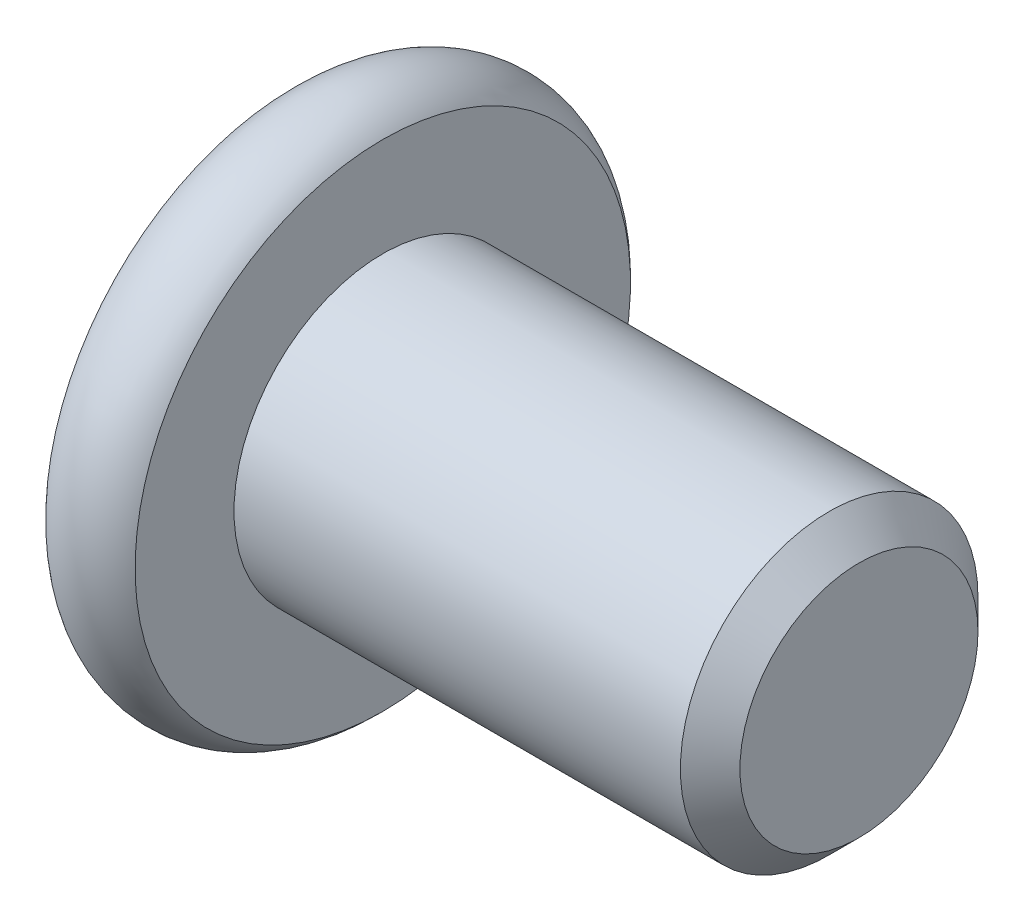
ISO-10303-21;
HEADER;
FILE_DESCRIPTION(('STEP AP214'),'2;1');
FILE_NAME('part.step','',(''),(''),'','','');
FILE_SCHEMA(('AUTOMOTIVE_DESIGN { 1 0 10303 214 1 1 1 1 }'));
ENDSEC;
DATA;
#1=APPLICATION_CONTEXT('core data for automotive mechanical design processes');
#2=APPLICATION_PROTOCOL_DEFINITION('international standard','automotive_design',2000,#1);
#3=PRODUCT_CONTEXT('',#1,'mechanical');
#4=PRODUCT('Part','Part','',(#3));
#5=PRODUCT_RELATED_PRODUCT_CATEGORY('part','',(#4));
#6=PRODUCT_DEFINITION_FORMATION('','',#4);
#7=PRODUCT_DEFINITION_CONTEXT('part definition',#1,'design');
#8=PRODUCT_DEFINITION('design','',#6,#7);
#9=PRODUCT_DEFINITION_SHAPE('','',#8);
#10=(LENGTH_UNIT() NAMED_UNIT(*) SI_UNIT(.MILLI.,.METRE.));
#11=(NAMED_UNIT(*) PLANE_ANGLE_UNIT() SI_UNIT($,.RADIAN.));
#12=(NAMED_UNIT(*) SI_UNIT($,.STERADIAN.) SOLID_ANGLE_UNIT());
#13=UNCERTAINTY_MEASURE_WITH_UNIT(LENGTH_MEASURE(1.E-05),#10,'distance_accuracy_value','');
#14=(GEOMETRIC_REPRESENTATION_CONTEXT(3) GLOBAL_UNCERTAINTY_ASSIGNED_CONTEXT((#13)) GLOBAL_UNIT_ASSIGNED_CONTEXT((#10,
#11,#12)) REPRESENTATION_CONTEXT('',''));
#15=CARTESIAN_POINT('',(0.,0.,0.));
#16=DIRECTION('',(0.,0.,1.));
#17=DIRECTION('',(1.,0.,0.));
#18=AXIS2_PLACEMENT_3D('',#15,#16,#17);
#19=CARTESIAN_POINT('',(-8.00000000000001,1.66533453693773E-13,0.));
#20=DIRECTION('',(0.999999999999996,0.,0.));
#21=DIRECTION('',(0.,0.,-1.));
#22=AXIS2_PLACEMENT_3D('',#19,#20,#21);
#23=CYLINDRICAL_SURFACE('',#22,2.5);
#24=CARTESIAN_POINT('',(-0.499999999999945,0.,0.));
#25=DIRECTION('',(0.999999999999996,0.,0.));
#26=DIRECTION('',(0.,0.,-1.));
#27=AXIS2_PLACEMENT_3D('',#24,#25,#26);
#28=CIRCLE('',#27,2.5);
#29=CARTESIAN_POINT('',(-0.499999999999945,1.61953783717195E-13,-2.5));
#30=VERTEX_POINT('',#29);
#31=EDGE_CURVE('E64',#30,#30,#28,.F.);
#32=CARTESIAN_POINT('',(-8.00000000000001,1.66533453693773E-13,0.));
#33=DIRECTION('',(0.999999999999996,0.,0.));
#34=DIRECTION('',(0.,1.,0.));
#35=AXIS2_PLACEMENT_3D('',#32,#33,#34);
#36=CIRCLE('',#35,2.5);
#37=CARTESIAN_POINT('',(-8.00000000000001,1.61953783717195E-13,-2.5));
#38=VERTEX_POINT('',#37);
#39=EDGE_CURVE('E140',#38,#38,#36,.F.);
#40=CARTESIAN_POINT('',(-0.499999999999945,1.61953783717195E-13,-2.5));
#41=CARTESIAN_POINT('',(-0.578124999999945,1.61953783717195E-13,-2.5));
#42=CARTESIAN_POINT('',(-0.656249999999946,1.61953783717195E-13,-2.5));
#43=CARTESIAN_POINT('',(-0.812499999999948,1.61953783717195E-13,-2.5));
#44=CARTESIAN_POINT('',(-0.890624999999948,1.61953783717195E-13,-2.5));
#45=CARTESIAN_POINT('',(-1.04687499999995,1.61953783717195E-13,-2.5));
#46=CARTESIAN_POINT('',(-1.12499999999995,1.61953783717195E-13,-2.5));
#47=CARTESIAN_POINT('',(-1.28124999999995,1.61953783717195E-13,-2.5));
#48=CARTESIAN_POINT('',(-1.35937499999995,1.61953783717195E-13,-2.5));
#49=CARTESIAN_POINT('',(-1.51562499999995,1.61953783717195E-13,-2.5));
#50=CARTESIAN_POINT('',(-1.59374999999995,1.61953783717195E-13,-2.5));
#51=CARTESIAN_POINT('',(-1.74999999999996,1.61953783717195E-13,-2.5));
#52=CARTESIAN_POINT('',(-1.82812499999996,1.61953783717195E-13,-2.5));
#53=CARTESIAN_POINT('',(-1.98437499999996,1.61953783717195E-13,-2.5));
#54=CARTESIAN_POINT('',(-2.06249999999996,1.61953783717195E-13,-2.5));
#55=CARTESIAN_POINT('',(-2.21874999999996,1.61953783717195E-13,-2.5));
#56=CARTESIAN_POINT('',(-2.29687499999996,1.61953783717195E-13,-2.5));
#57=CARTESIAN_POINT('',(-2.45312499999996,1.61953783717195E-13,-2.5));
#58=CARTESIAN_POINT('',(-2.53124999999996,1.61953783717195E-13,-2.5));
#59=CARTESIAN_POINT('',(-2.68749999999996,1.61953783717195E-13,-2.5));
#60=CARTESIAN_POINT('',(-2.76562499999996,1.61953783717195E-13,-2.5));
#61=CARTESIAN_POINT('',(-2.92187499999997,1.61953783717195E-13,-2.5));
#62=CARTESIAN_POINT('',(-2.99999999999997,1.61953783717195E-13,-2.5));
#63=CARTESIAN_POINT('',(-3.15624999999997,1.61953783717195E-13,-2.5));
#64=CARTESIAN_POINT('',(-3.23437499999997,1.61953783717195E-13,-2.5));
#65=CARTESIAN_POINT('',(-3.39062499999997,1.61953783717195E-13,-2.5));
#66=CARTESIAN_POINT('',(-3.46874999999997,1.61953783717195E-13,-2.5));
#67=CARTESIAN_POINT('',(-3.62499999999997,1.61953783717195E-13,-2.5));
#68=CARTESIAN_POINT('',(-3.70312499999997,1.61953783717195E-13,-2.5));
#69=CARTESIAN_POINT('',(-3.85937499999997,1.61953783717195E-13,-2.5));
#70=CARTESIAN_POINT('',(-3.93749999999997,1.61953783717195E-13,-2.5));
#71=CARTESIAN_POINT('',(-4.09374999999998,1.61953783717195E-13,-2.5));
#72=CARTESIAN_POINT('',(-4.17187499999998,1.61953783717195E-13,-2.5));
#73=CARTESIAN_POINT('',(-4.32812499999998,1.61953783717195E-13,-2.5));
#74=CARTESIAN_POINT('',(-4.40624999999998,1.61953783717195E-13,-2.5));
#75=CARTESIAN_POINT('',(-4.56249999999998,1.61953783717195E-13,-2.5));
#76=CARTESIAN_POINT('',(-4.64062499999998,1.61953783717195E-13,-2.5));
#77=CARTESIAN_POINT('',(-4.79687499999998,1.61953783717195E-13,-2.5));
#78=CARTESIAN_POINT('',(-4.87499999999998,1.61953783717195E-13,-2.5));
#79=CARTESIAN_POINT('',(-5.03124999999998,1.61953783717195E-13,-2.5));
#80=CARTESIAN_POINT('',(-5.10937499999998,1.61953783717195E-13,-2.5));
#81=CARTESIAN_POINT('',(-5.26562499999998,1.61953783717195E-13,-2.5));
#82=CARTESIAN_POINT('',(-5.34374999999999,1.61953783717195E-13,-2.5));
#83=CARTESIAN_POINT('',(-5.49999999999999,1.61953783717195E-13,-2.5));
#84=CARTESIAN_POINT('',(-5.57812499999999,1.61953783717195E-13,-2.5));
#85=CARTESIAN_POINT('',(-5.73437499999999,1.61953783717195E-13,-2.5));
#86=CARTESIAN_POINT('',(-5.81249999999999,1.61953783717195E-13,-2.5));
#87=CARTESIAN_POINT('',(-5.96874999999999,1.61953783717195E-13,-2.5));
#88=CARTESIAN_POINT('',(-6.04687499999999,1.61953783717195E-13,-2.5));
#89=CARTESIAN_POINT('',(-6.20312499999999,1.61953783717195E-13,-2.5));
#90=CARTESIAN_POINT('',(-6.28124999999999,1.61953783717195E-13,-2.5));
#91=CARTESIAN_POINT('',(-6.43749999999999,1.61953783717195E-13,-2.5));
#92=CARTESIAN_POINT('',(-6.515625,1.61953783717195E-13,-2.5));
#93=CARTESIAN_POINT('',(-6.671875,1.61953783717195E-13,-2.5));
#94=CARTESIAN_POINT('',(-6.75,1.61953783717195E-13,-2.5));
#95=CARTESIAN_POINT('',(-6.90625,1.61953783717195E-13,-2.5));
#96=CARTESIAN_POINT('',(-6.984375,1.61953783717195E-13,-2.5));
#97=CARTESIAN_POINT('',(-7.140625,1.61953783717195E-13,-2.5));
#98=CARTESIAN_POINT('',(-7.21875,1.61953783717195E-13,-2.5));
#99=CARTESIAN_POINT('',(-7.375,1.61953783717195E-13,-2.5));
#100=CARTESIAN_POINT('',(-7.453125,1.61953783717195E-13,-2.5));
#101=CARTESIAN_POINT('',(-7.60937500000001,1.61953783717195E-13,-2.5));
#102=CARTESIAN_POINT('',(-7.68750000000001,1.61953783717195E-13,-2.5));
#103=CARTESIAN_POINT('',(-7.84375000000001,1.61953783717195E-13,-2.5));
#104=CARTESIAN_POINT('',(-7.92187500000001,1.61953783717195E-13,-2.5));
#105=CARTESIAN_POINT('',(-8.00000000000001,1.61953783717195E-13,-2.5));
#106=B_SPLINE_CURVE_WITH_KNOTS('',3,(#40,#41,#42,#43,#44,#45,#46,#47,#48,#49,#50,#51,#52,#53,
#54,#55,#56,#57,#58,#59,#60,#61,#62,#63,#64,#65,#66,#67,#68,#69,#70,#71,#72,#73,#74,#75,#76,#77,
#78,#79,#80,#81,#82,#83,#84,#85,#86,#87,#88,#89,#90,#91,#92,#93,#94,#95,#96,#97,#98,#99,#100,
#101,#102,#103,#104,#105),.UNSPECIFIED.,.F.,.F.,(4,2,2,2,2,2,2,2,2,2,2,2,2,2,2,2,2,2,2,2,2,2,2,
2,2,2,2,2,2,2,2,2,4),(0.,0.234375000000002,0.468750000000004,0.703125000000007,
0.937500000000009,1.17187500000001,1.40625000000001,1.64062500000001,1.87500000000002,
2.10937500000002,2.34375000000002,2.57812500000002,2.81250000000002,3.04687500000003,
3.28125000000003,3.51562500000003,3.75000000000003,3.98437500000003,4.21875000000004,
4.45312500000004,4.68750000000004,4.92187500000004,5.15625000000004,5.39062500000005,
5.62500000000005,5.85937500000005,6.09375000000005,6.32812500000005,6.56250000000006,
6.79687500000006,7.03125000000006,7.26562500000006,7.50000000000006),.UNSPECIFIED.);
#107=EDGE_CURVE('BSEAM50',#30,#38,#106,.T.);
#108=ORIENTED_EDGE('',*,*,#31,.T.);
#109=ORIENTED_EDGE('',*,*,#39,.F.);
#110=ORIENTED_EDGE('',*,*,#107,.T.);
#111=ORIENTED_EDGE('',*,*,#107,.F.);
#112=EDGE_LOOP('',(#108,#110,#109,#111));
#113=FACE_BOUND('',#112,.T.);
#114=ADVANCED_FACE('F50',(#113),#23,.T.);
#115=CARTESIAN_POINT('',(0.,0.,0.));
#116=DIRECTION('',(0.999999999999996,0.,0.));
#117=DIRECTION('',(0.,0.,-1.));
#118=AXIS2_PLACEMENT_3D('',#115,#116,#117);
#119=PLANE('',#118);
#120=CARTESIAN_POINT('',(0.,0.,0.));
#121=DIRECTION('',(0.999999999999996,0.,0.));
#122=DIRECTION('',(0.,0.,-1.));
#123=AXIS2_PLACEMENT_3D('',#120,#121,#122);
#124=CIRCLE('',#123,2.);
#125=CARTESIAN_POINT('',(0.,0.,-2.));
#126=VERTEX_POINT('',#125);
#127=EDGE_CURVE('E143',#126,#126,#124,.T.);
#128=ORIENTED_EDGE('',*,*,#127,.T.);
#129=EDGE_LOOP('',(#128));
#130=FACE_BOUND('',#129,.T.);
#131=ADVANCED_FACE('F153',(#130),#119,.T.);
#132=CARTESIAN_POINT('',(0.,0.,0.));
#133=DIRECTION('',(-0.999999999999996,0.,0.));
#134=DIRECTION('',(0.,0.,1.));
#135=AXIS2_PLACEMENT_3D('',#132,#133,#134);
#136=CONICAL_SURFACE('',#135,2.,0.785398163397447);
#137=ORIENTED_EDGE('',*,*,#31,.F.);
#138=EDGE_LOOP('',(#137));
#139=FACE_BOUND('',#138,.T.);
#140=ORIENTED_EDGE('',*,*,#127,.F.);
#141=EDGE_LOOP('',(#140));
#142=FACE_BOUND('',#141,.T.);
#143=ADVANCED_FACE('F52',(#139,#142),#136,.T.);
#144=CARTESIAN_POINT('',(-9.50000000000006,-1.13797860024079E-12,-5.77315972805081E-12));
#145=DIRECTION('',(-0.999999999999996,0.,0.));
#146=DIRECTION('',(0.,-1.,0.));
#147=AXIS2_PLACEMENT_3D('',#144,#145,#146);
#148=PLANE('',#147);
#149=CARTESIAN_POINT('',(-9.50000000000006,-6.93889390390723E-13,-6.66133814775094E-12));
#150=DIRECTION('',(-0.999999999999996,0.,0.));
#151=DIRECTION('',(0.,-1.,0.));
#152=AXIS2_PLACEMENT_3D('',#149,#150,#151);
#153=CIRCLE('',#152,1.78205080756887);
#154=CARTESIAN_POINT('',(-9.50000000000007,-1.78205080756956,-6.66339081435746E-12));
#155=VERTEX_POINT('',#154);
#156=EDGE_CURVE('E258',#155,#155,#153,.T.);
#157=ORIENTED_EDGE('',*,*,#156,.F.);
#158=EDGE_LOOP('',(#157));
#159=FACE_BOUND('',#158,.T.);
#160=CARTESIAN_POINT('',(-9.50000000000006,-1.13797860024079E-12,-5.77315972805081E-12));
#161=DIRECTION('',(0.999999999999996,0.,0.));
#162=DIRECTION('',(0.,1.,0.));
#163=AXIS2_PLACEMENT_3D('',#160,#161,#162);
#164=CIRCLE('',#163,4.16143782776615);
#165=CARTESIAN_POINT('',(-9.50000000000007,4.16143782776502,-5.76836634930543E-12));
#166=VERTEX_POINT('',#165);
#167=EDGE_CURVE('E137',#166,#166,#164,.T.);
#168=ORIENTED_EDGE('',*,*,#167,.F.);
#169=EDGE_LOOP('',(#168));
#170=FACE_BOUND('',#169,.T.);
#171=ADVANCED_FACE('F152',(#159,#170),#148,.T.);
#172=CARTESIAN_POINT('',(-8.75000000000004,-4.27435864480685E-12,-2.66453525910038E-12));
#173=DIRECTION('',(0.999999999999996,0.,0.));
#174=DIRECTION('',(0.,1.,0.));
#175=AXIS2_PLACEMENT_3D('',#172,#173,#174);
#176=TOROIDAL_SURFACE('',#175,3.5,1.);
#177=ORIENTED_EDGE('',*,*,#167,.T.);
#178=EDGE_LOOP('',(#177));
#179=FACE_BOUND('',#178,.T.);
#180=CARTESIAN_POINT('',(-8.00000000000001,8.32667268468867E-13,0.));
#181=DIRECTION('',(0.999999999999996,0.,0.));
#182=DIRECTION('',(0.,1.,0.));
#183=AXIS2_PLACEMENT_3D('',#180,#181,#182);
#184=CIRCLE('',#183,4.16143782776615);
#185=CARTESIAN_POINT('',(-8.00000000000001,4.16143782776699,0.));
#186=VERTEX_POINT('',#185);
#187=EDGE_CURVE('E134',#186,#186,#184,.T.);
#188=ORIENTED_EDGE('',*,*,#187,.F.);
#189=EDGE_LOOP('',(#188));
#190=FACE_BOUND('',#189,.T.);
#191=ADVANCED_FACE('F164',(#179,#190),#176,.T.);
#192=CARTESIAN_POINT('',(-8.00000000000001,4.16143782776607,4.44089209850063E-13));
#193=DIRECTION('',(0.999999999999996,0.,0.));
#194=DIRECTION('',(0.,1.,0.));
#195=AXIS2_PLACEMENT_3D('',#192,#193,#194);
#196=PLANE('',#195);
#197=ORIENTED_EDGE('',*,*,#39,.T.);
#198=EDGE_LOOP('',(#197));
#199=FACE_BOUND('',#198,.T.);
#200=ORIENTED_EDGE('',*,*,#187,.T.);
#201=EDGE_LOOP('',(#200));
#202=FACE_BOUND('',#201,.T.);
#203=ADVANCED_FACE('F168',(#199,#202),#196,.T.);
#204=CARTESIAN_POINT('',(-9.50000000000006,-6.93889390390723E-13,-6.66133814775094E-12));
#205=DIRECTION('',(-0.999999999999996,0.,0.));
#206=DIRECTION('',(0.,-1.,0.));
#207=AXIS2_PLACEMENT_3D('',#204,#205,#206);
#208=CONICAL_SURFACE('',#207,1.78205080756887,0.78539816339745);
#209=ORIENTED_EDGE('',*,*,#156,.T.);
#210=EDGE_LOOP('',(#209));
#211=FACE_BOUND('',#210,.T.);
#212=CARTESIAN_POINT('',(-10.0154280856135,-1.74023253176822,1.49999999999118));
#213=CARTESIAN_POINT('',(-9.98338110734561,-1.69791724929931,1.49999999999314));
#214=CARTESIAN_POINT('',(-9.9516444672854,-1.65536760966972,1.49999999999397));
#215=CARTESIAN_POINT('',(-9.8889203936168,-1.56970398156847,1.4999999999946));
#216=CARTESIAN_POINT('',(-9.85793314822141,-1.52658985543013,1.49999999999439));
#217=CARTESIAN_POINT('',(-9.76584616434617,-1.39562626326718,1.49999999999406));
#218=CARTESIAN_POINT('',(-9.70611451230321,-1.30679868010714,1.49999999999422));
#219=CARTESIAN_POINT('',(-9.58873428910231,-1.12044622640312,1.49999999999435));
#220=CARTESIAN_POINT('',(-9.53140827748345,-1.02271587306744,1.4999999999943));
#221=CARTESIAN_POINT('',(-9.42646321497646,-0.822357214965961,1.49999999999427));
#222=CARTESIAN_POINT('',(-9.37881142368928,-0.719746931702862,1.4999999999943));
#223=CARTESIAN_POINT('',(-9.3205099883153,-0.565852387095739,1.49999999999428));
#224=CARTESIAN_POINT('',(-9.30379905354162,-0.516874191425152,1.49999999999427));
#225=CARTESIAN_POINT('',(-9.2743077515099,-0.417723988457795,1.4999999999943));
#226=CARTESIAN_POINT('',(-9.26152765142275,-0.367551900264141,1.49999999999435));
#227=CARTESIAN_POINT('',(-9.24077842024669,-0.267158299056292,1.49999999999422));
#228=CARTESIAN_POINT('',(-9.2327260618271,-0.216954261864951,1.49999999999404));
#229=CARTESIAN_POINT('',(-9.22159163683471,-0.115994915871359,1.49999999999453));
#230=CARTESIAN_POINT('',(-9.21850868863764,-0.0652397064615972,1.49999999999519));
#231=CARTESIAN_POINT('',(-9.2175473897404,0.0344222234873747,1.49999999999515));
#232=CARTESIAN_POINT('',(-9.21947892169593,0.0833271701098051,1.49999999999449));
#233=CARTESIAN_POINT('',(-9.22801757296896,0.180724293126812,1.49999999999407));
#234=CARTESIAN_POINT('',(-9.23462514204908,0.229216429361298,1.49999999999431));
#235=CARTESIAN_POINT('',(-9.2522650626457,0.326258027696466,1.49999999999425));
#236=CARTESIAN_POINT('',(-9.26337316820218,0.374793507449396,1.49999999999393));
#237=CARTESIAN_POINT('',(-9.28941986696031,0.470802295833572,1.49999999999463));
#238=CARTESIAN_POINT('',(-9.30435815600366,0.518275688480788,1.49999999999565));
#239=CARTESIAN_POINT('',(-9.35683954571518,0.667150562064508,1.49999999999696));
#240=CARTESIAN_POINT('',(-9.40033511654433,0.766448362425554,1.49999999999499));
#241=CARTESIAN_POINT('',(-9.49705878148431,0.960384405671832,1.49999999999357));
#242=CARTESIAN_POINT('',(-9.55032172266774,1.05500437383417,1.49999999999411));
#243=CARTESIAN_POINT('',(-9.66022580104507,1.2358452032132,1.49999999999444));
#244=CARTESIAN_POINT('',(-9.71656825310419,1.32224986946334,1.49999999999425));
#245=CARTESIAN_POINT('',(-9.80367557259664,1.44954953726221,1.49999999999429));
#246=CARTESIAN_POINT('',(-9.83301999068354,1.4914336848215,1.49999999999436));
#247=CARTESIAN_POINT('',(-9.89248691829206,1.5746291478298,1.4999999999942));
#248=CARTESIAN_POINT('',(-9.92260921149903,1.61594061772345,1.49999999999397));
#249=CARTESIAN_POINT('',(-9.95305411813341,1.65701358742404,1.4999999999934));
#250=B_SPLINE_CURVE_WITH_KNOTS('',3,(#212,#213,#214,#215,#216,#217,#218,#219,#220,#221,#222,
#223,#224,#225,#226,#227,#228,#229,#230,#231,#232,#233,#234,#235,#236,#237,#238,#239,#240,#241,
#242,#243,#244,#245,#246,#247,#248,#249),.UNSPECIFIED.,.F.,.F.,(4,2,2,2,2,2,2,2,2,2,2,2,2,2,2,2,
2,2,4),(0.,0.159238974218406,0.318517535014681,0.639504781933084,0.979137893800452,
1.31760168934509,1.47272233841782,1.62785352839951,1.78016486537539,1.93244917778474,
2.07904486260467,2.2256546495849,2.37484213303545,2.52401777304161,2.84828365283807,
3.17372975666727,3.48303030530474,3.63644667013801,3.78982082222755),.UNSPECIFIED.);
#251=CARTESIAN_POINT('',(-9.44999999999996,-0.86602540378497,1.49999999998984));
#252=VERTEX_POINT('',#251);
#253=CARTESIAN_POINT('',(-9.44999999999996,0.866025403784637,1.49999999999162));
#254=VERTEX_POINT('',#253);
#255=EDGE_CURVE('E118',#252,#254,#250,.T.);
#256=ORIENTED_EDGE('',*,*,#255,.F.);
#257=CARTESIAN_POINT('',(-9.45011548160046,-1.7321662776231,-0.000200000006334022));
#258=CARTESIAN_POINT('',(-9.42036547606916,-1.70239359976144,0.0513677907322042));
#259=CARTESIAN_POINT('',(-9.39236248391262,-1.67212305186635,0.103797917660605));
#260=CARTESIAN_POINT('',(-9.34108923044268,-1.61039789003908,0.210709034051107));
#261=CARTESIAN_POINT('',(-9.31784750504669,-1.57893740312861,0.265200195810007));
#262=CARTESIAN_POINT('',(-9.27803372899499,-1.51549879898288,0.375079081353167));
#263=CARTESIAN_POINT('',(-9.26136158567433,-1.48353684527203,0.430438809091839));
#264=CARTESIAN_POINT('',(-9.2356744568201,-1.41890915196348,0.542377257472106));
#265=CARTESIAN_POINT('',(-9.22664029047876,-1.38624538780907,0.598952556545563));
#266=CARTESIAN_POINT('',(-9.2184890812276,-1.32995210095229,0.696455389509446));
#267=CARTESIAN_POINT('',(-9.21728225299166,-1.30639533311332,0.737256908275016));
#268=CARTESIAN_POINT('',(-9.21931405716583,-1.25932335290595,0.818787969611508));
#269=CARTESIAN_POINT('',(-9.22255367075131,-1.2358081508563,0.859517494309834));
#270=CARTESIAN_POINT('',(-9.23329198598499,-1.18900414978722,0.940584402158364));
#271=CARTESIAN_POINT('',(-9.24079465302234,-1.16571558212079,0.980921384593427));
#272=CARTESIAN_POINT('',(-9.25965161193064,-1.11952932016598,1.06091833690887));
#273=CARTESIAN_POINT('',(-9.27100755701909,-1.09663179808887,1.10057800851056));
#274=CARTESIAN_POINT('',(-9.30472164759182,-1.03798159809715,1.20216313476811));
#275=CARTESIAN_POINT('',(-9.32962184909503,-1.00259267147746,1.26345855370351));
#276=CARTESIAN_POINT('',(-9.37165665327415,-0.950557780608698,1.35358562845705));
#277=CARTESIAN_POINT('',(-9.38642515356151,-0.933410759681554,1.38328513990139));
#278=CARTESIAN_POINT('',(-9.41731056594169,-0.899432102000021,1.44213790137695));
#279=CARTESIAN_POINT('',(-9.43342683412248,-0.882600319288449,1.47129140421343));
#280=CARTESIAN_POINT('',(-9.45011548160002,-0.865909933731868,1.50019999999218));
#281=B_SPLINE_CURVE_WITH_KNOTS('',3,(#257,#258,#259,#260,#261,#262,#263,#264,#265,#266,#267,
#268,#269,#270,#271,#272,#273,#274,#275,#276,#277,#278,#279,#280),.UNSPECIFIED.,.F.,.F.,(4,2,2,
2,2,2,2,2,2,2,2,4),(0.,0.199829143692569,0.400822987382005,0.598623720538013,0.795926240188346,
0.937113067958993,1.07833105577111,1.21968061668129,1.36109089930938,1.58570969637338,
1.69770705470697,1.80965120736861),.UNSPECIFIED.);
#282=CARTESIAN_POINT('',(-9.4500000000004,-1.73205080756914,-8.43769498715119E-12));
#283=VERTEX_POINT('',#282);
#284=EDGE_CURVE('E214',#283,#252,#281,.T.);
#285=ORIENTED_EDGE('',*,*,#284,.F.);
#286=CARTESIAN_POINT('',(-9.45011548160046,-0.865909933729203,-1.50020000000906));
#287=CARTESIAN_POINT('',(-9.42036547606558,-0.895682611589933,-1.44863220927083));
#288=CARTESIAN_POINT('',(-9.39236248390789,-0.925953159484864,-1.39620208234228));
#289=CARTESIAN_POINT('',(-9.34108923043738,-0.987678321311917,-1.28929096595188));
#290=CARTESIAN_POINT('',(-9.31784750504191,-1.01913880822233,-1.23479980419326));
#291=CARTESIAN_POINT('',(-9.27803372898874,-1.08257741236767,-1.12492091865068));
#292=CARTESIAN_POINT('',(-9.26136158566615,-1.11453936607819,-1.06956119091229));
#293=CARTESIAN_POINT('',(-9.23567445681579,-1.17916705938731,-0.95762274253171));
#294=CARTESIAN_POINT('',(-9.22664029048026,-1.21183082354263,-0.901047443457645));
#295=CARTESIAN_POINT('',(-9.21848908122651,-1.26812411039982,-0.803544610492688));
#296=CARTESIAN_POINT('',(-9.21728225298575,-1.29168087823865,-0.76274309172659));
#297=CARTESIAN_POINT('',(-9.21931405715666,-1.33875285844614,-0.681212030389556));
#298=CARTESIAN_POINT('',(-9.22255367074368,-1.36226806049605,-0.640482505691215));
#299=CARTESIAN_POINT('',(-9.23329198597735,-1.40907206156528,-0.55941559784188));
#300=CARTESIAN_POINT('',(-9.24079465301318,-1.4323606292316,-0.519078615406029));
#301=CARTESIAN_POINT('',(-9.25965161192483,-1.47854689118741,-0.439081663091343));
#302=CARTESIAN_POINT('',(-9.27100755701816,-1.50144441326563,-0.399421991491205));
#303=CARTESIAN_POINT('',(-9.30472164759444,-1.56009461325854,-0.297836865233866));
#304=CARTESIAN_POINT('',(-9.329621849091,-1.59548353987732,-0.236541446294857));
#305=CARTESIAN_POINT('',(-9.37165665326746,-1.64751843074578,-0.146414371539137));
#306=CARTESIAN_POINT('',(-9.38642515355512,-1.66466545167297,-0.116714860094663));
#307=CARTESIAN_POINT('',(-9.41731056593762,-1.69864410935519,-0.0578620986198284));
#308=CARTESIAN_POINT('',(-9.43342683412046,-1.71547589206739,-0.0287085957842115));
#309=CARTESIAN_POINT('',(-9.45011548160046,-1.7321662776249,0.000199999993011346));
#310=B_SPLINE_CURVE_WITH_KNOTS('',3,(#286,#287,#288,#289,#290,#291,#292,#293,#294,#295,#296,
#297,#298,#299,#300,#301,#302,#303,#304,#305,#306,#307,#308,#309),.UNSPECIFIED.,.F.,.F.,(4,2,2,
2,2,2,2,2,2,2,2,4),(0.,0.199829143694443,0.400822987382773,0.598623720538337,0.79592624018984,
0.937113067962155,1.0783310557748,1.21968061668595,1.36109089931531,1.58570969638119,
1.69770705471533,1.80965120737824),.UNSPECIFIED.);
#311=CARTESIAN_POINT('',(-9.4500000000004,-0.866025403785803,-1.50000000000761));
#312=VERTEX_POINT('',#311);
#313=EDGE_CURVE('E208',#312,#283,#310,.T.);
#314=ORIENTED_EDGE('',*,*,#313,.F.);
#315=CARTESIAN_POINT('',(-10.0154280856133,-1.740232531766,-1.50000000000761));
#316=CARTESIAN_POINT('',(-9.98338110734266,-1.69791724929879,-1.50000000000286));
#317=CARTESIAN_POINT('',(-9.9516444672811,-1.65536760966984,-1.50000000000083));
#318=CARTESIAN_POINT('',(-9.88892039361122,-1.56970398156891,-1.49999999999928));
#319=CARTESIAN_POINT('',(-9.8579331482159,-1.52658985543025,-1.49999999999976));
#320=CARTESIAN_POINT('',(-9.76584616434138,-1.39562626326735,-1.50000000000064));
#321=CARTESIAN_POINT('',(-9.70611451229897,-1.30679868010786,-1.50000000000047));
#322=CARTESIAN_POINT('',(-9.58873428909672,-1.12044622640552,-1.49999999999961));
#323=CARTESIAN_POINT('',(-9.53140827747583,-1.02271587307103,-1.4999999999989));
#324=CARTESIAN_POINT('',(-9.42646321497385,-0.822357214967428,-1.5000000000012));
#325=CARTESIAN_POINT('',(-9.37881142369375,-0.719746931701012,-1.5000000000042));
#326=CARTESIAN_POINT('',(-9.32050998831388,-0.565852387094923,-1.50000000000204));
#327=CARTESIAN_POINT('',(-9.30379905353602,-0.51687419142548,-1.50000000000042));
#328=CARTESIAN_POINT('',(-9.27430775150152,-0.417723988458938,-1.49999999999969));
#329=CARTESIAN_POINT('',(-9.26152765141577,-0.367551900264961,-1.50000000000058));
#330=CARTESIAN_POINT('',(-9.24077842023922,-0.267158299057007,-1.49999999999954));
#331=CARTESIAN_POINT('',(-9.23272606181779,-0.216954261865876,-1.49999999999766));
#332=CARTESIAN_POINT('',(-9.22159163682918,-0.115994915871951,-1.50000000000244));
#333=CARTESIAN_POINT('',(-9.21850868863775,-0.0652397064616432,-1.5000000000091));
#334=CARTESIAN_POINT('',(-9.21754738974029,0.0344222234883154,-1.50000000000878));
#335=CARTESIAN_POINT('',(-9.21947892169036,0.0833271701111903,-1.50000000000231));
#336=CARTESIAN_POINT('',(-9.22801757295976,0.180724293128506,-1.4999999999978));
#337=CARTESIAN_POINT('',(-9.23462514204168,0.229216429362858,-1.49999999999976));
#338=CARTESIAN_POINT('',(-9.25226506263886,0.326258027698181,-1.50000000000036));
#339=CARTESIAN_POINT('',(-9.26337316819406,0.374793507451406,-1.49999999999895));
#340=CARTESIAN_POINT('',(-9.28941986695482,0.470802295834941,-1.50000000000116));
#341=CARTESIAN_POINT('',(-9.30435815600212,0.518275688481215,-1.50000000000479));
#342=CARTESIAN_POINT('',(-9.35683954571925,0.667150562064312,-1.5000000000095));
#343=CARTESIAN_POINT('',(-9.40033511654195,0.766448362428426,-1.50000000000261));
#344=CARTESIAN_POINT('',(-9.49705878147753,0.960384405676841,-1.49999999999749));
#345=CARTESIAN_POINT('',(-9.55032172266298,1.05500437383827,-1.4999999999993));
#346=CARTESIAN_POINT('',(-9.66022580104195,1.23584520321595,-1.50000000000078));
#347=CARTESIAN_POINT('',(-9.71656825310079,1.32224986946562,-1.50000000000056));
#348=CARTESIAN_POINT('',(-9.8036755725926,1.44954953726474,-1.49999999999981));
#349=CARTESIAN_POINT('',(-9.8330199906794,1.49143368482448,-1.49999999999949));
#350=CARTESIAN_POINT('',(-9.89248691828963,1.57462914783241,-1.50000000000063));
#351=CARTESIAN_POINT('',(-9.92260921149842,1.61594061772523,-1.50000000000208));
#352=CARTESIAN_POINT('',(-9.95305411813652,1.65701358742357,-1.50000000000539));
#353=B_SPLINE_CURVE_WITH_KNOTS('',3,(#315,#316,#317,#318,#319,#320,#321,#322,#323,#324,#325,
#326,#327,#328,#329,#330,#331,#332,#333,#334,#335,#336,#337,#338,#339,#340,#341,#342,#343,#344,
#345,#346,#347,#348,#349,#350,#351,#352),.UNSPECIFIED.,.F.,.F.,(4,2,2,2,2,2,2,2,2,2,2,2,2,2,2,2,
2,2,4),(0.,0.159238974219267,0.31851753501614,0.639504781932671,0.979137893799061,
1.3176016893451,1.47272233841862,1.6278535284002,1.78016486537593,1.93244917778621,
2.07904486260712,2.22565464958731,2.37484213303784,2.52401777304484,2.84828365284321,
3.17372975667203,3.48303030530825,3.63644667014242,3.78982082223312),.UNSPECIFIED.);
#354=CARTESIAN_POINT('',(-9.44999999999996,0.866025403783055,-1.50000000000849));
#355=VERTEX_POINT('',#354);
#356=EDGE_CURVE('E71',#355,#312,#353,.F.);
#357=ORIENTED_EDGE('',*,*,#356,.F.);
#358=CARTESIAN_POINT('',(-9.45011548160002,1.73216627762279,0.000199999997452238));
#359=CARTESIAN_POINT('',(-9.42036547606798,1.70239359975948,-0.0513677907404452));
#360=CARTESIAN_POINT('',(-9.39236248391117,1.67212305186393,-0.103797917669001));
#361=CARTESIAN_POINT('',(-9.34108923044096,1.61039789003648,-0.21070903405993));
#362=CARTESIAN_POINT('',(-9.31784750504494,1.57893740312629,-0.265200195819097));
#363=CARTESIAN_POINT('',(-9.27803372899235,1.51549879897975,-0.375079081362058));
#364=CARTESIAN_POINT('',(-9.26136158567084,1.48353684526785,-0.43043880910028));
#365=CARTESIAN_POINT('',(-9.235674456818,1.41890915196155,-0.542377257482768));
#366=CARTESIAN_POINT('',(-9.2266402904789,1.38624538781043,-0.598952556558892));
#367=CARTESIAN_POINT('',(-9.21848908122674,1.32995210095194,-0.696455389522841));
#368=CARTESIAN_POINT('',(-9.21728225298894,1.30639533311006,-0.737256908287116));
#369=CARTESIAN_POINT('',(-9.21931405716189,1.2593233529005,-0.818787969623018));
#370=CARTESIAN_POINT('',(-9.22255367074801,1.23580815085157,-0.85951749432205));
#371=CARTESIAN_POINT('',(-9.2332919859819,1.18900414978238,-0.940584402171264));
#372=CARTESIAN_POINT('',(-9.24079465301884,1.16571558211512,-0.980921384606302));
#373=CARTESIAN_POINT('',(-9.2596516119284,1.1195293201612,-1.06091833692263));
#374=CARTESIAN_POINT('',(-9.27100755701852,1.09663179808581,-1.10057800852522));
#375=CARTESIAN_POINT('',(-9.30472164759261,1.03798159809509,-1.20216313478357));
#376=CARTESIAN_POINT('',(-9.32962184909375,1.00259267147255,-1.26345855371819));
#377=CARTESIAN_POINT('',(-9.37165665327215,0.950557780602353,-1.35358562847135));
#378=CARTESIAN_POINT('',(-9.38642515355966,0.933410759675212,-1.38328513991568));
#379=CARTESIAN_POINT('',(-9.41731056594054,0.89943210199458,-1.44213790139159));
#380=CARTESIAN_POINT('',(-9.43342683412191,0.882600319283905,-1.47129140422843));
#381=CARTESIAN_POINT('',(-9.45011548160002,0.865909933728676,-1.50020000000772));
#382=B_SPLINE_CURVE_WITH_KNOTS('',3,(#358,#359,#360,#361,#362,#363,#364,#365,#366,#367,#368,
#369,#370,#371,#372,#373,#374,#375,#376,#377,#378,#379,#380,#381),.UNSPECIFIED.,.F.,.F.,(4,2,2,
2,2,2,2,2,2,2,2,4),(0.,0.199829143694004,0.400822987383833,0.598623720540583,0.795926240192222,
0.937113067964069,1.07833105577697,1.21968061668808,1.36109089931716,1.58570969638153,
1.69770705471521,1.80965120737716),.UNSPECIFIED.);
#383=CARTESIAN_POINT('',(-9.44999999999996,1.73205080756686,-6.21724893790088E-12));
#384=VERTEX_POINT('',#383);
#385=EDGE_CURVE('E13',#384,#355,#382,.T.);
#386=ORIENTED_EDGE('',*,*,#385,.F.);
#387=CARTESIAN_POINT('',(-9.45011548160002,0.86590993372912,1.5001999999904));
#388=CARTESIAN_POINT('',(-9.4203654760675,0.895682611594211,1.44863220925453));
#389=CARTESIAN_POINT('',(-9.39236248391059,0.925953159490392,1.39620208232707));
#390=CARTESIAN_POINT('',(-9.34108923044058,0.987678321318083,1.28929096593739));
#391=CARTESIAN_POINT('',(-9.31784750504488,1.01913880822788,1.23479980417837));
#392=CARTESIAN_POINT('',(-9.27803372899313,1.08257741237375,1.12492091863596));
#393=CARTESIAN_POINT('',(-9.26136158567213,1.11453936608538,1.06956119089813));
#394=CARTESIAN_POINT('',(-9.23567445681877,1.17916705939141,0.957622742516863));
#395=CARTESIAN_POINT('',(-9.22664029047863,1.21183082354254,0.901047443441561));
#396=CARTESIAN_POINT('',(-9.21848908122692,1.26812411040043,0.803544610478337));
#397=CARTESIAN_POINT('',(-9.21728225298998,1.2916808782419,0.762743091714126));
#398=CARTESIAN_POINT('',(-9.21931405716347,1.33875285845099,0.681212030378526));
#399=CARTESIAN_POINT('',(-9.22255367074926,1.36226806049985,0.640482505679733));
#400=CARTESIAN_POINT('',(-9.23329198598283,1.40907206156892,0.559415597831016));
#401=CARTESIAN_POINT('',(-9.24079465301977,1.43236062923614,0.519078615396234));
#402=CARTESIAN_POINT('',(-9.25965161192897,1.47854689118957,0.439081663080076));
#403=CARTESIAN_POINT('',(-9.27100755701873,1.50144441326449,0.399421991477393));
#404=CARTESIAN_POINT('',(-9.30472164759237,1.56009461325487,0.297836865219034));
#405=CARTESIAN_POINT('',(-9.32962184909372,1.59548353987793,0.236541446284817));
#406=CARTESIAN_POINT('',(-9.37165665327198,1.64751843074848,0.146414371531848));
#407=CARTESIAN_POINT('',(-9.38642515355937,1.66466545167567,0.116714860087521));
#408=CARTESIAN_POINT('',(-9.41731056594019,1.69864410935598,0.0578620986114749));
#409=CARTESIAN_POINT('',(-9.43342683412161,1.71547589206629,0.0287085957744985));
#410=CARTESIAN_POINT('',(-9.45011548160002,1.73216627762082,-0.000200000005001755));
#411=B_SPLINE_CURVE_WITH_KNOTS('',3,(#387,#388,#389,#390,#391,#392,#393,#394,#395,#396,#397,
#398,#399,#400,#401,#402,#403,#404,#405,#406,#407,#408,#409,#410),.UNSPECIFIED.,.F.,.F.,(4,2,2,
2,2,2,2,2,2,2,2,4),(0.,0.199829143692352,0.400822987380862,0.598623720535992,0.795926240185835,
0.937113067956809,1.07833105576899,1.21968061667936,1.36109089930775,1.58570969637203,
1.69770705470562,1.80965120736748),.UNSPECIFIED.);
#412=EDGE_CURVE('E109',#254,#384,#411,.T.);
#413=ORIENTED_EDGE('',*,*,#412,.F.);
#414=EDGE_LOOP('',(#256,#285,#314,#357,#386,#413));
#415=FACE_BOUND('',#414,.T.);
#416=ADVANCED_FACE('F108',(#211,#415),#208,.F.);
#417=CARTESIAN_POINT('',(-7.19999999999987,1.66533453693773E-13,0.));
#418=DIRECTION('',(-0.999999999999996,0.,0.));
#419=DIRECTION('',(0.,-1.,0.));
#420=AXIS2_PLACEMENT_3D('',#417,#418,#419);
#421=PLANE('',#420);
#422=DIRECTION('',(0.,0.499999999999999,-0.866025403784438));
#423=VECTOR('',#422,1.);
#424=CARTESIAN_POINT('',(-7.19999999999987,0.866025403783499,1.49999999999562));
#425=LINE('',#424,#423);
#426=CARTESIAN_POINT('',(-7.19999999999987,0.866025403783499,1.49999999999562));
#427=VERTEX_POINT('',#426);
#428=CARTESIAN_POINT('',(-7.2000000000001,1.7320508075695,-3.5527136788005E-12));
#429=VERTEX_POINT('',#428);
#430=EDGE_CURVE('E117',#427,#429,#425,.T.);
#431=ORIENTED_EDGE('',*,*,#430,.T.);
#432=DIRECTION('',(0.,-0.500000000000002,-0.866025403784441));
#433=VECTOR('',#432,1.);
#434=CARTESIAN_POINT('',(-7.2000000000001,1.7320508075695,-3.5527136788005E-12));
#435=LINE('',#434,#433);
#436=CARTESIAN_POINT('',(-7.2000000000001,0.86602540378572,-1.50000000000006));
#437=VERTEX_POINT('',#436);
#438=EDGE_CURVE('E122',#429,#437,#435,.T.);
#439=ORIENTED_EDGE('',*,*,#438,.T.);
#440=DIRECTION('',(0.,-1.,0.));
#441=VECTOR('',#440,1.);
#442=CARTESIAN_POINT('',(-7.2000000000001,0.86602540378572,-1.50000000000006));
#443=LINE('',#442,#441);
#444=CARTESIAN_POINT('',(-7.20000000000054,-0.866025403783166,-1.50000000000095));
#445=VERTEX_POINT('',#444);
#446=EDGE_CURVE('E240',#437,#445,#443,.T.);
#447=ORIENTED_EDGE('',*,*,#446,.T.);
#448=DIRECTION('',(0.,-0.500000000000001,0.866025403784438));
#449=VECTOR('',#448,1.);
#450=CARTESIAN_POINT('',(-7.20000000000054,-0.866025403783166,-1.50000000000095));
#451=LINE('',#450,#449);
#452=CARTESIAN_POINT('',(-7.20000000000032,-1.73205080757141,-3.99680288865056E-12));
#453=VERTEX_POINT('',#452);
#454=EDGE_CURVE('E244',#445,#453,#451,.T.);
#455=ORIENTED_EDGE('',*,*,#454,.T.);
#456=DIRECTION('',(0.,0.500000000000002,0.866025403784441));
#457=VECTOR('',#456,1.);
#458=CARTESIAN_POINT('',(-7.20000000000032,-1.73205080757141,-3.99680288865056E-12));
#459=LINE('',#458,#457);
#460=CARTESIAN_POINT('',(-7.19999999999987,-0.866025403785636,1.49999999999428));
#461=VERTEX_POINT('',#460);
#462=EDGE_CURVE('E130',#453,#461,#459,.T.);
#463=ORIENTED_EDGE('',*,*,#462,.T.);
#464=DIRECTION('',(0.,1.,0.));
#465=VECTOR('',#464,1.);
#466=CARTESIAN_POINT('',(-7.19999999999987,-0.866025403785636,1.49999999999428));
#467=LINE('',#466,#465);
#468=EDGE_CURVE('E125',#461,#427,#467,.T.);
#469=ORIENTED_EDGE('',*,*,#468,.T.);
#470=EDGE_LOOP('',(#431,#439,#447,#455,#463,#469));
#471=FACE_BOUND('',#470,.T.);
#472=ADVANCED_FACE('F194',(#471),#421,.T.);
#473=CARTESIAN_POINT('',(-7.2000000000001,1.7320508075695,-3.5527136788005E-12));
#474=DIRECTION('',(0.,0.866025403784441,-0.499999999999999));
#475=DIRECTION('',(0.,0.500000000000002,0.866025403784441));
#476=AXIS2_PLACEMENT_3D('',#473,#474,#475);
#477=PLANE('',#476);
#478=DIRECTION('',(-0.999999999999996,0.,0.));
#479=VECTOR('',#478,1.);
#480=CARTESIAN_POINT('',(-7.2000000000001,1.7320508075695,-3.5527136788005E-12));
#481=LINE('',#480,#479);
#482=EDGE_CURVE('E115',#429,#384,#481,.T.);
#483=ORIENTED_EDGE('',*,*,#482,.T.);
#484=ORIENTED_EDGE('',*,*,#385,.T.);
#485=DIRECTION('',(-0.999999999999996,0.,0.));
#486=VECTOR('',#485,1.);
#487=CARTESIAN_POINT('',(-7.2000000000001,0.86602540378572,-1.50000000000006));
#488=LINE('',#487,#486);
#489=EDGE_CURVE('E124',#437,#355,#488,.T.);
#490=ORIENTED_EDGE('',*,*,#489,.F.);
#491=ORIENTED_EDGE('',*,*,#438,.F.);
#492=EDGE_LOOP('',(#483,#484,#490,#491));
#493=FACE_BOUND('',#492,.T.);
#494=ADVANCED_FACE('F120',(#493),#477,.F.);
#495=CARTESIAN_POINT('',(-7.2000000000001,0.86602540378572,-1.50000000000006));
#496=DIRECTION('',(0.,0.,-1.));
#497=DIRECTION('',(-0.999999999999996,0.,0.));
#498=AXIS2_PLACEMENT_3D('',#495,#496,#497);
#499=PLANE('',#498);
#500=ORIENTED_EDGE('',*,*,#489,.T.);
#501=ORIENTED_EDGE('',*,*,#356,.T.);
#502=DIRECTION('',(-0.999999999999996,0.,0.));
#503=VECTOR('',#502,1.);
#504=CARTESIAN_POINT('',(-7.20000000000054,-0.866025403783166,-1.50000000000095));
#505=LINE('',#504,#503);
#506=EDGE_CURVE('E127',#445,#312,#505,.T.);
#507=ORIENTED_EDGE('',*,*,#506,.F.);
#508=ORIENTED_EDGE('',*,*,#446,.F.);
#509=EDGE_LOOP('',(#500,#501,#507,#508));
#510=FACE_BOUND('',#509,.T.);
#511=ADVANCED_FACE('F229',(#510),#499,.F.);
#512=CARTESIAN_POINT('',(-7.20000000000054,-0.866025403783166,-1.50000000000095));
#513=DIRECTION('',(0.,-0.866025403784444,-0.5));
#514=DIRECTION('',(0.,0.500000000000001,-0.866025403784438));
#515=AXIS2_PLACEMENT_3D('',#512,#513,#514);
#516=PLANE('',#515);
#517=ORIENTED_EDGE('',*,*,#506,.T.);
#518=ORIENTED_EDGE('',*,*,#313,.T.);
#519=DIRECTION('',(-0.999999999999996,0.,0.));
#520=VECTOR('',#519,1.);
#521=CARTESIAN_POINT('',(-7.20000000000032,-1.73205080757141,-3.99680288865056E-12));
#522=LINE('',#521,#520);
#523=EDGE_CURVE('E254',#453,#283,#522,.T.);
#524=ORIENTED_EDGE('',*,*,#523,.F.);
#525=ORIENTED_EDGE('',*,*,#454,.F.);
#526=EDGE_LOOP('',(#517,#518,#524,#525));
#527=FACE_BOUND('',#526,.T.);
#528=ADVANCED_FACE('F224',(#527),#516,.F.);
#529=CARTESIAN_POINT('',(-7.20000000000032,-1.73205080757141,-3.99680288865056E-12));
#530=DIRECTION('',(0.,-0.866025403784441,0.499999999999999));
#531=DIRECTION('',(0.,-0.500000000000002,-0.866025403784441));
#532=AXIS2_PLACEMENT_3D('',#529,#530,#531);
#533=PLANE('',#532);
#534=ORIENTED_EDGE('',*,*,#523,.T.);
#535=ORIENTED_EDGE('',*,*,#284,.T.);
#536=DIRECTION('',(-0.999999999999996,0.,0.));
#537=VECTOR('',#536,1.);
#538=CARTESIAN_POINT('',(-7.19999999999987,-0.866025403785636,1.49999999999428));
#539=LINE('',#538,#537);
#540=EDGE_CURVE('E251',#461,#252,#539,.T.);
#541=ORIENTED_EDGE('',*,*,#540,.F.);
#542=ORIENTED_EDGE('',*,*,#462,.F.);
#543=EDGE_LOOP('',(#534,#535,#541,#542));
#544=FACE_BOUND('',#543,.T.);
#545=ADVANCED_FACE('F221',(#544),#533,.F.);
#546=CARTESIAN_POINT('',(-7.19999999999987,-0.866025403785636,1.49999999999428));
#547=DIRECTION('',(0.,0.,1.));
#548=DIRECTION('',(0.999999999999996,0.,0.));
#549=AXIS2_PLACEMENT_3D('',#546,#547,#548);
#550=PLANE('',#549);
#551=ORIENTED_EDGE('',*,*,#540,.T.);
#552=ORIENTED_EDGE('',*,*,#255,.T.);
#553=DIRECTION('',(-0.999999999999996,0.,0.));
#554=VECTOR('',#553,1.);
#555=CARTESIAN_POINT('',(-7.19999999999987,0.866025403783499,1.49999999999562));
#556=LINE('',#555,#554);
#557=EDGE_CURVE('E78',#427,#254,#556,.T.);
#558=ORIENTED_EDGE('',*,*,#557,.F.);
#559=ORIENTED_EDGE('',*,*,#468,.F.);
#560=EDGE_LOOP('',(#551,#552,#558,#559));
#561=FACE_BOUND('',#560,.T.);
#562=ADVANCED_FACE('F175',(#561),#550,.F.);
#563=CARTESIAN_POINT('',(-7.19999999999987,0.866025403783499,1.49999999999562));
#564=DIRECTION('',(0.,0.866025403784445,0.5));
#565=DIRECTION('',(0.,-0.499999999999999,0.866025403784438));
#566=AXIS2_PLACEMENT_3D('',#563,#564,#565);
#567=PLANE('',#566);
#568=ORIENTED_EDGE('',*,*,#557,.T.);
#569=ORIENTED_EDGE('',*,*,#412,.T.);
#570=ORIENTED_EDGE('',*,*,#482,.F.);
#571=ORIENTED_EDGE('',*,*,#430,.F.);
#572=EDGE_LOOP('',(#568,#569,#570,#571));
#573=FACE_BOUND('',#572,.T.);
#574=ADVANCED_FACE('F114',(#573),#567,.F.);
#575=CLOSED_SHELL('',(#114,#131,#143,#171,#191,#203,#416,#472,#494,#511,#528,#545,#562,#574));
#576=MANIFOLD_SOLID_BREP('B2',#575);
#577=ADVANCED_BREP_SHAPE_REPRESENTATION('',(#18,#576),#14);
#578=SHAPE_DEFINITION_REPRESENTATION(#9,#577);
ENDSEC;
END-ISO-10303-21;
